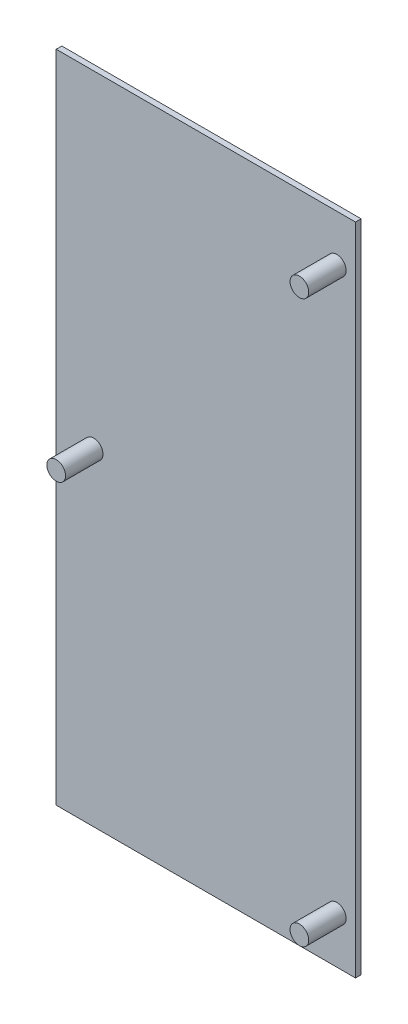
ISO-10303-21;
HEADER;
FILE_DESCRIPTION(('STEP AP214'),'2;1');
FILE_NAME('part.step','',(''),(''),'','','');
FILE_SCHEMA(('AUTOMOTIVE_DESIGN { 1 0 10303 214 1 1 1 1 }'));
ENDSEC;
DATA;
#1=APPLICATION_CONTEXT('core data for automotive mechanical design processes');
#2=APPLICATION_PROTOCOL_DEFINITION('international standard','automotive_design',2000,#1);
#3=PRODUCT_CONTEXT('',#1,'mechanical');
#4=PRODUCT('Part','Part','',(#3));
#5=PRODUCT_RELATED_PRODUCT_CATEGORY('part','',(#4));
#6=PRODUCT_DEFINITION_FORMATION('','',#4);
#7=PRODUCT_DEFINITION_CONTEXT('part definition',#1,'design');
#8=PRODUCT_DEFINITION('design','',#6,#7);
#9=PRODUCT_DEFINITION_SHAPE('','',#8);
#10=(LENGTH_UNIT() NAMED_UNIT(*) SI_UNIT(.MILLI.,.METRE.));
#11=(NAMED_UNIT(*) PLANE_ANGLE_UNIT() SI_UNIT($,.RADIAN.));
#12=(NAMED_UNIT(*) SI_UNIT($,.STERADIAN.) SOLID_ANGLE_UNIT());
#13=UNCERTAINTY_MEASURE_WITH_UNIT(LENGTH_MEASURE(1.E-05),#10,'distance_accuracy_value','');
#14=(GEOMETRIC_REPRESENTATION_CONTEXT(3) GLOBAL_UNCERTAINTY_ASSIGNED_CONTEXT((#13)) GLOBAL_UNIT_ASSIGNED_CONTEXT((#10,
#11,#12)) REPRESENTATION_CONTEXT('',''));
#15=CARTESIAN_POINT('',(0.,0.,0.));
#16=DIRECTION('',(0.,0.,1.));
#17=DIRECTION('',(1.,0.,0.));
#18=AXIS2_PLACEMENT_3D('',#15,#16,#17);
#19=CARTESIAN_POINT('',(80.,175.,3.));
#20=DIRECTION('',(-1.,0.,0.));
#21=DIRECTION('',(0.,-1.,0.));
#22=AXIS2_PLACEMENT_3D('',#19,#20,#21);
#23=PLANE('',#22);
#24=DIRECTION('',(0.,1.,0.));
#25=VECTOR('',#24,1.);
#26=CARTESIAN_POINT('',(80.,175.,0.));
#27=LINE('',#26,#25);
#28=CARTESIAN_POINT('',(80.,-175.,0.));
#29=VERTEX_POINT('',#28);
#30=CARTESIAN_POINT('',(80.,175.,0.));
#31=VERTEX_POINT('',#30);
#32=EDGE_CURVE('E110',#29,#31,#27,.T.);
#33=ORIENTED_EDGE('',*,*,#32,.T.);
#34=DIRECTION('',(0.,0.,-1.));
#35=VECTOR('',#34,1.);
#36=CARTESIAN_POINT('',(80.,175.,3.));
#37=LINE('',#36,#35);
#38=CARTESIAN_POINT('',(80.,175.,3.));
#39=VERTEX_POINT('',#38);
#40=EDGE_CURVE('E48',#39,#31,#37,.T.);
#41=ORIENTED_EDGE('',*,*,#40,.F.);
#42=DIRECTION('',(0.,1.,0.));
#43=VECTOR('',#42,1.);
#44=CARTESIAN_POINT('',(80.,175.,3.));
#45=LINE('',#44,#43);
#46=CARTESIAN_POINT('',(80.,-175.,3.));
#47=VERTEX_POINT('',#46);
#48=EDGE_CURVE('E92',#47,#39,#45,.T.);
#49=ORIENTED_EDGE('',*,*,#48,.F.);
#50=DIRECTION('',(0.,0.,-1.));
#51=VECTOR('',#50,1.);
#52=CARTESIAN_POINT('',(80.,-175.,3.));
#53=LINE('',#52,#51);
#54=EDGE_CURVE('E106',#47,#29,#53,.T.);
#55=ORIENTED_EDGE('',*,*,#54,.T.);
#56=EDGE_LOOP('',(#33,#41,#49,#55));
#57=FACE_BOUND('',#56,.T.);
#58=ADVANCED_FACE('F39',(#57),#23,.F.);
#59=CARTESIAN_POINT('',(-80.,175.,3.));
#60=DIRECTION('',(0.,-1.,0.));
#61=DIRECTION('',(0.,0.,-1.));
#62=AXIS2_PLACEMENT_3D('',#59,#60,#61);
#63=PLANE('',#62);
#64=DIRECTION('',(-1.,0.,0.));
#65=VECTOR('',#64,1.);
#66=CARTESIAN_POINT('',(-80.,175.,0.));
#67=LINE('',#66,#65);
#68=CARTESIAN_POINT('',(-80.,175.,0.));
#69=VERTEX_POINT('',#68);
#70=EDGE_CURVE('E98',#31,#69,#67,.T.);
#71=ORIENTED_EDGE('',*,*,#70,.T.);
#72=DIRECTION('',(0.,0.,-1.));
#73=VECTOR('',#72,1.);
#74=CARTESIAN_POINT('',(-80.,175.,3.));
#75=LINE('',#74,#73);
#76=CARTESIAN_POINT('',(-80.,175.,3.));
#77=VERTEX_POINT('',#76);
#78=EDGE_CURVE('E96',#77,#69,#75,.T.);
#79=ORIENTED_EDGE('',*,*,#78,.F.);
#80=DIRECTION('',(-1.,0.,0.));
#81=VECTOR('',#80,1.);
#82=CARTESIAN_POINT('',(-80.,175.,3.));
#83=LINE('',#82,#81);
#84=EDGE_CURVE('E87',#39,#77,#83,.T.);
#85=ORIENTED_EDGE('',*,*,#84,.F.);
#86=ORIENTED_EDGE('',*,*,#40,.T.);
#87=EDGE_LOOP('',(#71,#79,#85,#86));
#88=FACE_BOUND('',#87,.T.);
#89=ADVANCED_FACE('F97',(#88),#63,.F.);
#90=CARTESIAN_POINT('',(-80.,175.,3.));
#91=DIRECTION('',(1.,0.,0.));
#92=DIRECTION('',(0.,1.,0.));
#93=AXIS2_PLACEMENT_3D('',#90,#91,#92);
#94=PLANE('',#93);
#95=DIRECTION('',(0.,-1.,0.));
#96=VECTOR('',#95,1.);
#97=CARTESIAN_POINT('',(-80.,175.,0.));
#98=LINE('',#97,#96);
#99=CARTESIAN_POINT('',(-80.,-175.,0.));
#100=VERTEX_POINT('',#99);
#101=EDGE_CURVE('E73',#69,#100,#98,.T.);
#102=ORIENTED_EDGE('',*,*,#101,.T.);
#103=DIRECTION('',(0.,0.,-1.));
#104=VECTOR('',#103,1.);
#105=CARTESIAN_POINT('',(-80.,-175.,3.));
#106=LINE('',#105,#104);
#107=CARTESIAN_POINT('',(-80.,-175.,3.));
#108=VERTEX_POINT('',#107);
#109=EDGE_CURVE('E100',#108,#100,#106,.T.);
#110=ORIENTED_EDGE('',*,*,#109,.F.);
#111=DIRECTION('',(0.,-1.,0.));
#112=VECTOR('',#111,1.);
#113=CARTESIAN_POINT('',(-80.,175.,3.));
#114=LINE('',#113,#112);
#115=EDGE_CURVE('E90',#77,#108,#114,.T.);
#116=ORIENTED_EDGE('',*,*,#115,.F.);
#117=ORIENTED_EDGE('',*,*,#78,.T.);
#118=EDGE_LOOP('',(#102,#110,#116,#117));
#119=FACE_BOUND('',#118,.T.);
#120=ADVANCED_FACE('F102',(#119),#94,.F.);
#121=CARTESIAN_POINT('',(-80.,-175.,3.));
#122=DIRECTION('',(0.,1.,0.));
#123=DIRECTION('',(0.,0.,1.));
#124=AXIS2_PLACEMENT_3D('',#121,#122,#123);
#125=PLANE('',#124);
#126=DIRECTION('',(1.,0.,0.));
#127=VECTOR('',#126,1.);
#128=CARTESIAN_POINT('',(-80.,-175.,0.));
#129=LINE('',#128,#127);
#130=EDGE_CURVE('E79',#100,#29,#129,.T.);
#131=ORIENTED_EDGE('',*,*,#130,.T.);
#132=ORIENTED_EDGE('',*,*,#54,.F.);
#133=DIRECTION('',(1.,0.,0.));
#134=VECTOR('',#133,1.);
#135=CARTESIAN_POINT('',(-80.,-175.,3.));
#136=LINE('',#135,#134);
#137=EDGE_CURVE('E56',#108,#47,#136,.T.);
#138=ORIENTED_EDGE('',*,*,#137,.F.);
#139=ORIENTED_EDGE('',*,*,#109,.T.);
#140=EDGE_LOOP('',(#131,#132,#138,#139));
#141=FACE_BOUND('',#140,.T.);
#142=ADVANCED_FACE('F139',(#141),#125,.F.);
#143=CARTESIAN_POINT('',(0.,0.,3.));
#144=DIRECTION('',(0.,0.,1.));
#145=DIRECTION('',(1.,0.,0.));
#146=AXIS2_PLACEMENT_3D('',#143,#144,#145);
#147=PLANE('',#146);
#148=CARTESIAN_POINT('',(-60.,0.,3.));
#149=DIRECTION('',(0.,0.,1.));
#150=DIRECTION('',(1.,0.,0.));
#151=AXIS2_PLACEMENT_3D('',#148,#149,#150);
#152=CIRCLE('',#151,5.);
#153=CARTESIAN_POINT('',(-55.,0.,3.));
#154=VERTEX_POINT('',#153);
#155=EDGE_CURVE('E218',#154,#154,#152,.T.);
#156=ORIENTED_EDGE('',*,*,#155,.F.);
#157=EDGE_LOOP('',(#156));
#158=FACE_BOUND('',#157,.T.);
#159=CARTESIAN_POINT('',(70.,-150.,3.));
#160=DIRECTION('',(0.,0.,1.));
#161=DIRECTION('',(1.,0.,0.));
#162=AXIS2_PLACEMENT_3D('',#159,#160,#161);
#163=CIRCLE('',#162,5.00000000000001);
#164=CARTESIAN_POINT('',(75.,-150.,3.));
#165=VERTEX_POINT('',#164);
#166=EDGE_CURVE('E11',#165,#165,#163,.T.);
#167=ORIENTED_EDGE('',*,*,#166,.F.);
#168=EDGE_LOOP('',(#167));
#169=FACE_BOUND('',#168,.T.);
#170=CARTESIAN_POINT('',(70.,150.,3.));
#171=DIRECTION('',(0.,0.,1.));
#172=DIRECTION('',(1.,0.,0.));
#173=AXIS2_PLACEMENT_3D('',#170,#171,#172);
#174=CIRCLE('',#173,5.00000000000001);
#175=CARTESIAN_POINT('',(75.,150.,3.));
#176=VERTEX_POINT('',#175);
#177=EDGE_CURVE('E206',#176,#176,#174,.T.);
#178=ORIENTED_EDGE('',*,*,#177,.F.);
#179=EDGE_LOOP('',(#178));
#180=FACE_BOUND('',#179,.T.);
#181=ORIENTED_EDGE('',*,*,#48,.T.);
#182=ORIENTED_EDGE('',*,*,#84,.T.);
#183=ORIENTED_EDGE('',*,*,#115,.T.);
#184=ORIENTED_EDGE('',*,*,#137,.T.);
#185=EDGE_LOOP('',(#181,#182,#183,#184));
#186=FACE_BOUND('',#185,.T.);
#187=ADVANCED_FACE('F88',(#158,#169,#180,#186),#147,.T.);
#188=CARTESIAN_POINT('',(0.,0.,0.));
#189=DIRECTION('',(0.,0.,1.));
#190=DIRECTION('',(1.,0.,0.));
#191=AXIS2_PLACEMENT_3D('',#188,#189,#190);
#192=PLANE('',#191);
#193=ORIENTED_EDGE('',*,*,#32,.F.);
#194=ORIENTED_EDGE('',*,*,#130,.F.);
#195=ORIENTED_EDGE('',*,*,#101,.F.);
#196=ORIENTED_EDGE('',*,*,#70,.F.);
#197=EDGE_LOOP('',(#193,#194,#195,#196));
#198=FACE_BOUND('',#197,.T.);
#199=ADVANCED_FACE('F128',(#198),#192,.F.);
#200=CARTESIAN_POINT('',(70.,150.,23.));
#201=DIRECTION('',(0.,0.,-1.));
#202=DIRECTION('',(-1.,0.,0.));
#203=AXIS2_PLACEMENT_3D('',#200,#201,#202);
#204=CYLINDRICAL_SURFACE('',#203,5.00000000000001);
#205=CARTESIAN_POINT('',(70.,150.,23.));
#206=DIRECTION('',(0.,0.,1.));
#207=DIRECTION('',(1.,0.,0.));
#208=AXIS2_PLACEMENT_3D('',#205,#206,#207);
#209=CIRCLE('',#208,5.00000000000001);
#210=CARTESIAN_POINT('',(75.,150.,23.));
#211=VERTEX_POINT('',#210);
#212=EDGE_CURVE('E114',#211,#211,#209,.T.);
#213=ORIENTED_EDGE('',*,*,#212,.F.);
#214=EDGE_LOOP('',(#213));
#215=FACE_BOUND('',#214,.T.);
#216=ORIENTED_EDGE('',*,*,#177,.T.);
#217=EDGE_LOOP('',(#216));
#218=FACE_BOUND('',#217,.T.);
#219=ADVANCED_FACE('F130',(#215,#218),#204,.T.);
#220=CARTESIAN_POINT('',(70.,150.,23.));
#221=DIRECTION('',(0.,0.,1.));
#222=DIRECTION('',(1.,0.,0.));
#223=AXIS2_PLACEMENT_3D('',#220,#221,#222);
#224=PLANE('',#223);
#225=ORIENTED_EDGE('',*,*,#212,.T.);
#226=EDGE_LOOP('',(#225));
#227=FACE_BOUND('',#226,.T.);
#228=ADVANCED_FACE('F136',(#227),#224,.T.);
#229=CARTESIAN_POINT('',(70.,-150.,23.));
#230=DIRECTION('',(0.,0.,-1.));
#231=DIRECTION('',(-1.,0.,0.));
#232=AXIS2_PLACEMENT_3D('',#229,#230,#231);
#233=CYLINDRICAL_SURFACE('',#232,5.00000000000001);
#234=CARTESIAN_POINT('',(70.,-150.,23.));
#235=DIRECTION('',(0.,0.,-1.));
#236=DIRECTION('',(1.,0.,0.));
#237=AXIS2_PLACEMENT_3D('',#234,#235,#236);
#238=CIRCLE('',#237,5.00000000000001);
#239=CARTESIAN_POINT('',(75.,-150.,23.));
#240=VERTEX_POINT('',#239);
#241=EDGE_CURVE('E210',#240,#240,#238,.T.);
#242=ORIENTED_EDGE('',*,*,#241,.T.);
#243=EDGE_LOOP('',(#242));
#244=FACE_BOUND('',#243,.T.);
#245=ORIENTED_EDGE('',*,*,#166,.T.);
#246=EDGE_LOOP('',(#245));
#247=FACE_BOUND('',#246,.T.);
#248=ADVANCED_FACE('F194',(#244,#247),#233,.T.);
#249=CARTESIAN_POINT('',(70.,-150.,23.));
#250=DIRECTION('',(0.,0.,1.));
#251=DIRECTION('',(1.,0.,0.));
#252=AXIS2_PLACEMENT_3D('',#249,#250,#251);
#253=PLANE('',#252);
#254=ORIENTED_EDGE('',*,*,#241,.F.);
#255=EDGE_LOOP('',(#254));
#256=FACE_BOUND('',#255,.T.);
#257=ADVANCED_FACE('F167',(#256),#253,.T.);
#258=CARTESIAN_POINT('',(-60.,0.,23.));
#259=DIRECTION('',(0.,0.,-1.));
#260=DIRECTION('',(-1.,0.,0.));
#261=AXIS2_PLACEMENT_3D('',#258,#259,#260);
#262=CYLINDRICAL_SURFACE('',#261,5.);
#263=CARTESIAN_POINT('',(-60.,0.,23.));
#264=DIRECTION('',(0.,0.,1.));
#265=DIRECTION('',(1.,0.,0.));
#266=AXIS2_PLACEMENT_3D('',#263,#264,#265);
#267=CIRCLE('',#266,5.);
#268=CARTESIAN_POINT('',(-55.,0.,23.));
#269=VERTEX_POINT('',#268);
#270=EDGE_CURVE('E217',#269,#269,#267,.T.);
#271=ORIENTED_EDGE('',*,*,#270,.F.);
#272=EDGE_LOOP('',(#271));
#273=FACE_BOUND('',#272,.T.);
#274=ORIENTED_EDGE('',*,*,#155,.T.);
#275=EDGE_LOOP('',(#274));
#276=FACE_BOUND('',#275,.T.);
#277=ADVANCED_FACE('F172',(#273,#276),#262,.T.);
#278=CARTESIAN_POINT('',(-60.,0.,23.));
#279=DIRECTION('',(0.,0.,1.));
#280=DIRECTION('',(1.,0.,0.));
#281=AXIS2_PLACEMENT_3D('',#278,#279,#280);
#282=PLANE('',#281);
#283=ORIENTED_EDGE('',*,*,#270,.T.);
#284=EDGE_LOOP('',(#283));
#285=FACE_BOUND('',#284,.T.);
#286=ADVANCED_FACE('F177',(#285),#282,.T.);
#287=CLOSED_SHELL('',(#58,#89,#120,#142,#187,#199,#219,#228,#248,#257,#277,#286));
#288=MANIFOLD_SOLID_BREP('B2',#287);
#289=ADVANCED_BREP_SHAPE_REPRESENTATION('',(#18,#288),#14);
#290=SHAPE_DEFINITION_REPRESENTATION(#9,#289);
ENDSEC;
END-ISO-10303-21;
